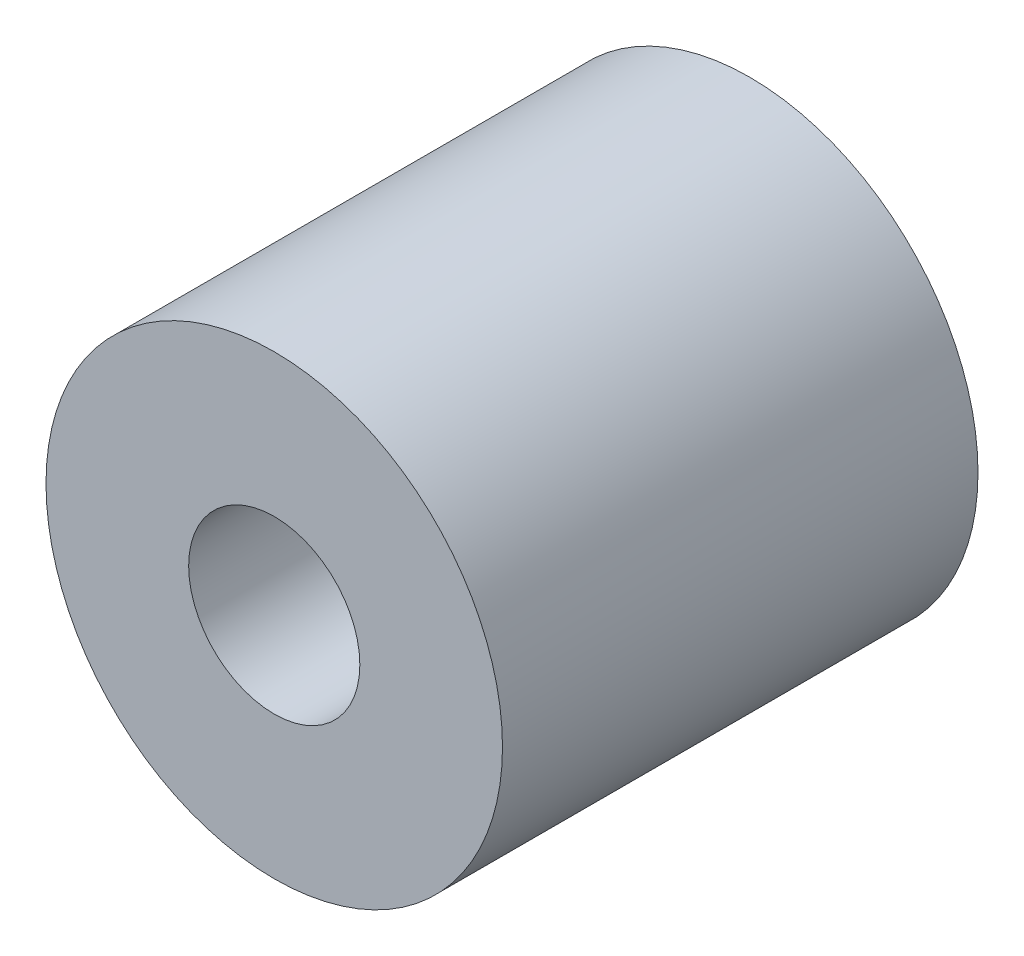
ISO-10303-21;
HEADER;
FILE_DESCRIPTION(('STEP AP214'),'2;1');
FILE_NAME('part.step','',(''),(''),'','','');
FILE_SCHEMA(('AUTOMOTIVE_DESIGN { 1 0 10303 214 1 1 1 1 }'));
ENDSEC;
DATA;
#1=APPLICATION_CONTEXT('core data for automotive mechanical design processes');
#2=APPLICATION_PROTOCOL_DEFINITION('international standard','automotive_design',2000,#1);
#3=PRODUCT_CONTEXT('',#1,'mechanical');
#4=PRODUCT('Part','Part','',(#3));
#5=PRODUCT_RELATED_PRODUCT_CATEGORY('part','',(#4));
#6=PRODUCT_DEFINITION_FORMATION('','',#4);
#7=PRODUCT_DEFINITION_CONTEXT('part definition',#1,'design');
#8=PRODUCT_DEFINITION('design','',#6,#7);
#9=PRODUCT_DEFINITION_SHAPE('','',#8);
#10=(LENGTH_UNIT() NAMED_UNIT(*) SI_UNIT(.MILLI.,.METRE.));
#11=(NAMED_UNIT(*) PLANE_ANGLE_UNIT() SI_UNIT($,.RADIAN.));
#12=(NAMED_UNIT(*) SI_UNIT($,.STERADIAN.) SOLID_ANGLE_UNIT());
#13=UNCERTAINTY_MEASURE_WITH_UNIT(LENGTH_MEASURE(1.E-05),#10,'distance_accuracy_value','');
#14=(GEOMETRIC_REPRESENTATION_CONTEXT(3) GLOBAL_UNCERTAINTY_ASSIGNED_CONTEXT((#13)) GLOBAL_UNIT_ASSIGNED_CONTEXT((#10,
#11,#12)) REPRESENTATION_CONTEXT('',''));
#15=CARTESIAN_POINT('',(0.,0.,0.));
#16=DIRECTION('',(0.,0.,1.));
#17=DIRECTION('',(1.,0.,0.));
#18=AXIS2_PLACEMENT_3D('',#15,#16,#17);
#19=CARTESIAN_POINT('',(0.,12.,-8.));
#20=DIRECTION('',(0.,0.,-1.));
#21=DIRECTION('',(-1.,0.,0.));
#22=AXIS2_PLACEMENT_3D('',#19,#20,#21);
#23=PLANE('',#22);
#24=CARTESIAN_POINT('',(0.,0.,-8.));
#25=DIRECTION('',(0.,0.,1.));
#26=DIRECTION('',(1.,0.,0.));
#27=AXIS2_PLACEMENT_3D('',#24,#25,#26);
#28=CIRCLE('',#27,4.5);
#29=CARTESIAN_POINT('',(4.5,0.,-8.));
#30=VERTEX_POINT('',#29);
#31=EDGE_CURVE('E11',#30,#30,#28,.T.);
#32=ORIENTED_EDGE('',*,*,#31,.F.);
#33=EDGE_LOOP('',(#32));
#34=FACE_BOUND('',#33,.T.);
#35=CARTESIAN_POINT('',(0.,0.,-8.));
#36=DIRECTION('',(0.,0.,1.));
#37=DIRECTION('',(1.,0.,0.));
#38=AXIS2_PLACEMENT_3D('',#35,#36,#37);
#39=CIRCLE('',#38,12.);
#40=CARTESIAN_POINT('',(12.,0.,-8.));
#41=VERTEX_POINT('',#40);
#42=EDGE_CURVE('E65',#41,#41,#39,.T.);
#43=ORIENTED_EDGE('',*,*,#42,.T.);
#44=EDGE_LOOP('',(#43));
#45=FACE_BOUND('',#44,.T.);
#46=ADVANCED_FACE('F51',(#34,#45),#23,.F.);
#47=CARTESIAN_POINT('',(0.,0.,24.4));
#48=DIRECTION('',(0.,0.,1.));
#49=DIRECTION('',(1.,0.,0.));
#50=AXIS2_PLACEMENT_3D('',#47,#48,#49);
#51=CYLINDRICAL_SURFACE('',#50,4.5);
#52=CARTESIAN_POINT('',(0.,0.,-33.));
#53=DIRECTION('',(0.,0.,1.));
#54=DIRECTION('',(1.,0.,0.));
#55=AXIS2_PLACEMENT_3D('',#52,#53,#54);
#56=CIRCLE('',#55,4.5);
#57=CARTESIAN_POINT('',(4.5,0.,-33.));
#58=VERTEX_POINT('',#57);
#59=EDGE_CURVE('E57',#58,#58,#56,.T.);
#60=ORIENTED_EDGE('',*,*,#59,.F.);
#61=EDGE_LOOP('',(#60));
#62=FACE_BOUND('',#61,.T.);
#63=ORIENTED_EDGE('',*,*,#31,.T.);
#64=EDGE_LOOP('',(#63));
#65=FACE_BOUND('',#64,.T.);
#66=ADVANCED_FACE('F80',(#62,#65),#51,.F.);
#67=CARTESIAN_POINT('',(0.,12.,-33.));
#68=DIRECTION('',(0.,0.,1.));
#69=DIRECTION('',(1.,0.,0.));
#70=AXIS2_PLACEMENT_3D('',#67,#68,#69);
#71=PLANE('',#70);
#72=CARTESIAN_POINT('',(0.,0.,-33.));
#73=DIRECTION('',(0.,0.,1.));
#74=DIRECTION('',(1.,0.,0.));
#75=AXIS2_PLACEMENT_3D('',#72,#73,#74);
#76=CIRCLE('',#75,12.);
#77=CARTESIAN_POINT('',(12.,0.,-33.));
#78=VERTEX_POINT('',#77);
#79=EDGE_CURVE('E61',#78,#78,#76,.T.);
#80=ORIENTED_EDGE('',*,*,#79,.F.);
#81=EDGE_LOOP('',(#80));
#82=FACE_BOUND('',#81,.T.);
#83=ORIENTED_EDGE('',*,*,#59,.T.);
#84=EDGE_LOOP('',(#83));
#85=FACE_BOUND('',#84,.T.);
#86=ADVANCED_FACE('F75',(#82,#85),#71,.F.);
#87=CARTESIAN_POINT('',(0.,0.,24.4));
#88=DIRECTION('',(0.,0.,1.));
#89=DIRECTION('',(1.,0.,0.));
#90=AXIS2_PLACEMENT_3D('',#87,#88,#89);
#91=CYLINDRICAL_SURFACE('',#90,12.);
#92=ORIENTED_EDGE('',*,*,#42,.F.);
#93=EDGE_LOOP('',(#92));
#94=FACE_BOUND('',#93,.T.);
#95=ORIENTED_EDGE('',*,*,#79,.T.);
#96=EDGE_LOOP('',(#95));
#97=FACE_BOUND('',#96,.T.);
#98=ADVANCED_FACE('F72',(#94,#97),#91,.T.);
#99=CLOSED_SHELL('',(#46,#66,#86,#98));
#100=MANIFOLD_SOLID_BREP('B2',#99);
#101=ADVANCED_BREP_SHAPE_REPRESENTATION('',(#18,#100),#14);
#102=SHAPE_DEFINITION_REPRESENTATION(#9,#101);
ENDSEC;
END-ISO-10303-21;
